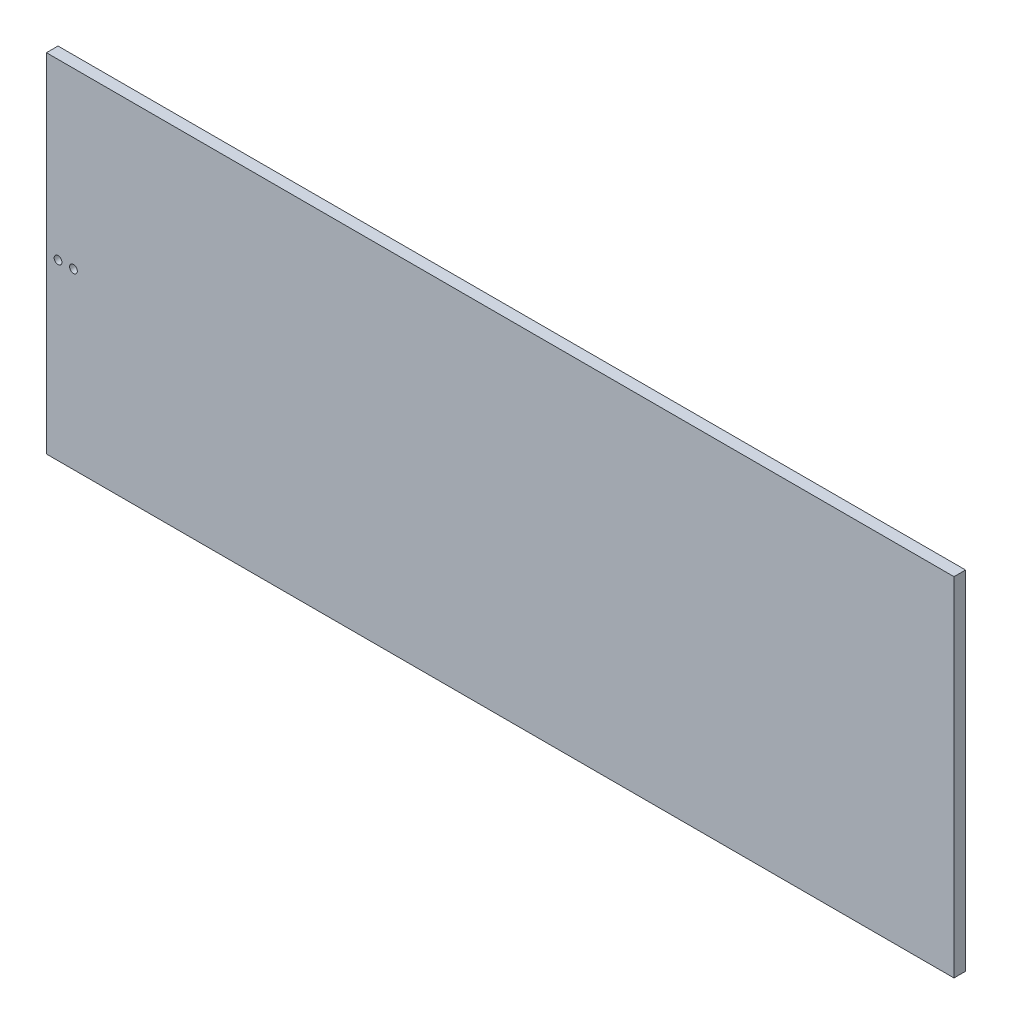
ISO-10303-21;
HEADER;
FILE_DESCRIPTION(('STEP AP214'),'2;1');
FILE_NAME('part.step','',(''),(''),'','','');
FILE_SCHEMA(('AUTOMOTIVE_DESIGN { 1 0 10303 214 1 1 1 1 }'));
ENDSEC;
DATA;
#1=APPLICATION_CONTEXT('core data for automotive mechanical design processes');
#2=APPLICATION_PROTOCOL_DEFINITION('international standard','automotive_design',2000,#1);
#3=PRODUCT_CONTEXT('',#1,'mechanical');
#4=PRODUCT('Part','Part','',(#3));
#5=PRODUCT_RELATED_PRODUCT_CATEGORY('part','',(#4));
#6=PRODUCT_DEFINITION_FORMATION('','',#4);
#7=PRODUCT_DEFINITION_CONTEXT('part definition',#1,'design');
#8=PRODUCT_DEFINITION('design','',#6,#7);
#9=PRODUCT_DEFINITION_SHAPE('','',#8);
#10=(LENGTH_UNIT() NAMED_UNIT(*) SI_UNIT(.MILLI.,.METRE.));
#11=(NAMED_UNIT(*) PLANE_ANGLE_UNIT() SI_UNIT($,.RADIAN.));
#12=(NAMED_UNIT(*) SI_UNIT($,.STERADIAN.) SOLID_ANGLE_UNIT());
#13=UNCERTAINTY_MEASURE_WITH_UNIT(LENGTH_MEASURE(1.E-05),#10,'distance_accuracy_value','');
#14=(GEOMETRIC_REPRESENTATION_CONTEXT(3) GLOBAL_UNCERTAINTY_ASSIGNED_CONTEXT((#13)) GLOBAL_UNIT_ASSIGNED_CONTEXT((#10,
#11,#12)) REPRESENTATION_CONTEXT('',''));
#15=CARTESIAN_POINT('',(0.,0.,0.));
#16=DIRECTION('',(0.,0.,1.));
#17=DIRECTION('',(1.,0.,0.));
#18=AXIS2_PLACEMENT_3D('',#15,#16,#17);
#19=CARTESIAN_POINT('',(117.5,-45.,3.));
#20=DIRECTION('',(-1.,0.,0.));
#21=DIRECTION('',(0.,0.,1.));
#22=AXIS2_PLACEMENT_3D('',#19,#20,#21);
#23=PLANE('',#22);
#24=DIRECTION('',(0.,1.,0.));
#25=VECTOR('',#24,1.);
#26=CARTESIAN_POINT('',(117.5,-45.,0.));
#27=LINE('',#26,#25);
#28=CARTESIAN_POINT('',(117.5,-45.,0.));
#29=VERTEX_POINT('',#28);
#30=CARTESIAN_POINT('',(117.5,45.,0.));
#31=VERTEX_POINT('',#30);
#32=EDGE_CURVE('E155',#29,#31,#27,.T.);
#33=ORIENTED_EDGE('',*,*,#32,.T.);
#34=DIRECTION('',(0.,0.,-1.));
#35=VECTOR('',#34,1.);
#36=CARTESIAN_POINT('',(117.5,45.,3.));
#37=LINE('',#36,#35);
#38=CARTESIAN_POINT('',(117.5,45.,3.));
#39=VERTEX_POINT('',#38);
#40=EDGE_CURVE('E11',#39,#31,#37,.T.);
#41=ORIENTED_EDGE('',*,*,#40,.F.);
#42=DIRECTION('',(0.,1.,0.));
#43=VECTOR('',#42,1.);
#44=CARTESIAN_POINT('',(117.5,-45.,3.));
#45=LINE('',#44,#43);
#46=CARTESIAN_POINT('',(117.5,-45.,3.));
#47=VERTEX_POINT('',#46);
#48=EDGE_CURVE('E144',#47,#39,#45,.T.);
#49=ORIENTED_EDGE('',*,*,#48,.F.);
#50=DIRECTION('',(0.,0.,-1.));
#51=VECTOR('',#50,1.);
#52=CARTESIAN_POINT('',(117.5,-45.,3.));
#53=LINE('',#52,#51);
#54=EDGE_CURVE('E154',#47,#29,#53,.T.);
#55=ORIENTED_EDGE('',*,*,#54,.T.);
#56=EDGE_LOOP('',(#33,#41,#49,#55));
#57=FACE_BOUND('',#56,.T.);
#58=ADVANCED_FACE('F38',(#57),#23,.F.);
#59=CARTESIAN_POINT('',(-117.5,45.,3.));
#60=DIRECTION('',(0.,-1.,0.));
#61=DIRECTION('',(0.,0.,-1.));
#62=AXIS2_PLACEMENT_3D('',#59,#60,#61);
#63=PLANE('',#62);
#64=DIRECTION('',(-1.,0.,0.));
#65=VECTOR('',#64,1.);
#66=CARTESIAN_POINT('',(-117.5,45.,0.));
#67=LINE('',#66,#65);
#68=CARTESIAN_POINT('',(-117.5,45.,0.));
#69=VERTEX_POINT('',#68);
#70=EDGE_CURVE('E159',#31,#69,#67,.T.);
#71=ORIENTED_EDGE('',*,*,#70,.T.);
#72=DIRECTION('',(0.,0.,-1.));
#73=VECTOR('',#72,1.);
#74=CARTESIAN_POINT('',(-117.5,45.,3.));
#75=LINE('',#74,#73);
#76=CARTESIAN_POINT('',(-117.5,45.,3.));
#77=VERTEX_POINT('',#76);
#78=EDGE_CURVE('E46',#77,#69,#75,.T.);
#79=ORIENTED_EDGE('',*,*,#78,.F.);
#80=DIRECTION('',(-1.,0.,0.));
#81=VECTOR('',#80,1.);
#82=CARTESIAN_POINT('',(-117.5,45.,3.));
#83=LINE('',#82,#81);
#84=EDGE_CURVE('E90',#39,#77,#83,.T.);
#85=ORIENTED_EDGE('',*,*,#84,.F.);
#86=ORIENTED_EDGE('',*,*,#40,.T.);
#87=EDGE_LOOP('',(#71,#79,#85,#86));
#88=FACE_BOUND('',#87,.T.);
#89=ADVANCED_FACE('F236',(#88),#63,.F.);
#90=CARTESIAN_POINT('',(-117.5,-45.,3.));
#91=DIRECTION('',(1.,0.,0.));
#92=DIRECTION('',(0.,0.,-1.));
#93=AXIS2_PLACEMENT_3D('',#90,#91,#92);
#94=PLANE('',#93);
#95=DIRECTION('',(0.,-1.,0.));
#96=VECTOR('',#95,1.);
#97=CARTESIAN_POINT('',(-117.5,-45.,0.));
#98=LINE('',#97,#96);
#99=CARTESIAN_POINT('',(-117.5,4.,0.));
#100=VERTEX_POINT('',#99);
#101=EDGE_CURVE('E163',#69,#100,#98,.T.);
#102=ORIENTED_EDGE('',*,*,#101,.T.);
#103=DIRECTION('',(0.,0.,-1.));
#104=VECTOR('',#103,1.);
#105=CARTESIAN_POINT('',(-117.5,4.,0.));
#106=LINE('',#105,#104);
#107=CARTESIAN_POINT('',(-117.5,4.,1.));
#108=VERTEX_POINT('',#107);
#109=EDGE_CURVE('E130',#108,#100,#106,.T.);
#110=ORIENTED_EDGE('',*,*,#109,.F.);
#111=DIRECTION('',(0.,1.,0.));
#112=VECTOR('',#111,1.);
#113=CARTESIAN_POINT('',(-117.5,4.,1.));
#114=LINE('',#113,#112);
#115=CARTESIAN_POINT('',(-117.5,-4.,1.00000000000001));
#116=VERTEX_POINT('',#115);
#117=EDGE_CURVE('E189',#116,#108,#114,.T.);
#118=ORIENTED_EDGE('',*,*,#117,.F.);
#119=DIRECTION('',(0.,0.,1.));
#120=VECTOR('',#119,1.);
#121=CARTESIAN_POINT('',(-117.5,-4.,0.));
#122=LINE('',#121,#120);
#123=CARTESIAN_POINT('',(-117.5,-4.,0.));
#124=VERTEX_POINT('',#123);
#125=EDGE_CURVE('E193',#124,#116,#122,.T.);
#126=ORIENTED_EDGE('',*,*,#125,.F.);
#127=CARTESIAN_POINT('',(-117.5,-45.,0.));
#128=VERTEX_POINT('',#127);
#129=EDGE_CURVE('E134',#124,#128,#98,.T.);
#130=ORIENTED_EDGE('',*,*,#129,.T.);
#131=DIRECTION('',(0.,0.,-1.));
#132=VECTOR('',#131,1.);
#133=CARTESIAN_POINT('',(-117.5,-45.,3.));
#134=LINE('',#133,#132);
#135=CARTESIAN_POINT('',(-117.5,-45.,3.));
#136=VERTEX_POINT('',#135);
#137=EDGE_CURVE('E171',#136,#128,#134,.T.);
#138=ORIENTED_EDGE('',*,*,#137,.F.);
#139=DIRECTION('',(0.,-1.,0.));
#140=VECTOR('',#139,1.);
#141=CARTESIAN_POINT('',(-117.5,-45.,3.));
#142=LINE('',#141,#140);
#143=EDGE_CURVE('E149',#77,#136,#142,.T.);
#144=ORIENTED_EDGE('',*,*,#143,.F.);
#145=ORIENTED_EDGE('',*,*,#78,.T.);
#146=EDGE_LOOP('',(#102,#110,#118,#126,#130,#138,#144,#145));
#147=FACE_BOUND('',#146,.T.);
#148=ADVANCED_FACE('F178',(#147),#94,.F.);
#149=CARTESIAN_POINT('',(-117.5,-45.,3.));
#150=DIRECTION('',(0.,1.,0.));
#151=DIRECTION('',(0.,0.,1.));
#152=AXIS2_PLACEMENT_3D('',#149,#150,#151);
#153=PLANE('',#152);
#154=DIRECTION('',(1.,0.,0.));
#155=VECTOR('',#154,1.);
#156=CARTESIAN_POINT('',(-117.5,-45.,0.));
#157=LINE('',#156,#155);
#158=EDGE_CURVE('E83',#128,#29,#157,.T.);
#159=ORIENTED_EDGE('',*,*,#158,.T.);
#160=ORIENTED_EDGE('',*,*,#54,.F.);
#161=DIRECTION('',(1.,0.,0.));
#162=VECTOR('',#161,1.);
#163=CARTESIAN_POINT('',(-117.5,-45.,3.));
#164=LINE('',#163,#162);
#165=EDGE_CURVE('E62',#136,#47,#164,.T.);
#166=ORIENTED_EDGE('',*,*,#165,.F.);
#167=ORIENTED_EDGE('',*,*,#137,.T.);
#168=EDGE_LOOP('',(#159,#160,#166,#167));
#169=FACE_BOUND('',#168,.T.);
#170=ADVANCED_FACE('F243',(#169),#153,.F.);
#171=CARTESIAN_POINT('',(0.,0.,3.));
#172=DIRECTION('',(0.,0.,-1.));
#173=DIRECTION('',(-1.,0.,0.));
#174=AXIS2_PLACEMENT_3D('',#171,#172,#173);
#175=PLANE('',#174);
#176=CARTESIAN_POINT('',(-110.5,0.,3.));
#177=DIRECTION('',(0.,0.,-1.));
#178=DIRECTION('',(-1.,0.,0.));
#179=AXIS2_PLACEMENT_3D('',#176,#177,#178);
#180=CIRCLE('',#179,0.999999999999998);
#181=CARTESIAN_POINT('',(-111.5,0.,3.));
#182=VERTEX_POINT('',#181);
#183=EDGE_CURVE('E195',#182,#182,#180,.T.);
#184=ORIENTED_EDGE('',*,*,#183,.T.);
#185=EDGE_LOOP('',(#184));
#186=FACE_BOUND('',#185,.T.);
#187=CARTESIAN_POINT('',(-114.5,0.,3.));
#188=DIRECTION('',(0.,0.,-1.));
#189=DIRECTION('',(-1.,0.,0.));
#190=AXIS2_PLACEMENT_3D('',#187,#188,#189);
#191=CIRCLE('',#190,0.999999999999998);
#192=CARTESIAN_POINT('',(-115.5,0.,3.));
#193=VERTEX_POINT('',#192);
#194=EDGE_CURVE('E202',#193,#193,#191,.T.);
#195=ORIENTED_EDGE('',*,*,#194,.T.);
#196=EDGE_LOOP('',(#195));
#197=FACE_BOUND('',#196,.T.);
#198=ORIENTED_EDGE('',*,*,#48,.T.);
#199=ORIENTED_EDGE('',*,*,#84,.T.);
#200=ORIENTED_EDGE('',*,*,#143,.T.);
#201=ORIENTED_EDGE('',*,*,#165,.T.);
#202=EDGE_LOOP('',(#198,#199,#200,#201));
#203=FACE_BOUND('',#202,.T.);
#204=ADVANCED_FACE('F232',(#186,#197,#203),#175,.F.);
#205=CARTESIAN_POINT('',(0.,0.,0.));
#206=DIRECTION('',(0.,0.,-1.));
#207=DIRECTION('',(-1.,0.,0.));
#208=AXIS2_PLACEMENT_3D('',#205,#206,#207);
#209=PLANE('',#208);
#210=DIRECTION('',(-1.,0.,0.));
#211=VECTOR('',#210,1.);
#212=CARTESIAN_POINT('',(-107.5,4.,0.));
#213=LINE('',#212,#211);
#214=CARTESIAN_POINT('',(-107.5,4.,0.));
#215=VERTEX_POINT('',#214);
#216=EDGE_CURVE('E160',#215,#100,#213,.T.);
#217=ORIENTED_EDGE('',*,*,#216,.T.);
#218=ORIENTED_EDGE('',*,*,#101,.F.);
#219=ORIENTED_EDGE('',*,*,#70,.F.);
#220=ORIENTED_EDGE('',*,*,#32,.F.);
#221=ORIENTED_EDGE('',*,*,#158,.F.);
#222=ORIENTED_EDGE('',*,*,#129,.F.);
#223=DIRECTION('',(-1.,0.,0.));
#224=VECTOR('',#223,1.);
#225=CARTESIAN_POINT('',(-107.5,-4.,0.));
#226=LINE('',#225,#224);
#227=CARTESIAN_POINT('',(-107.5,-4.,0.));
#228=VERTEX_POINT('',#227);
#229=EDGE_CURVE('E117',#228,#124,#226,.T.);
#230=ORIENTED_EDGE('',*,*,#229,.F.);
#231=DIRECTION('',(0.,-1.,0.));
#232=VECTOR('',#231,1.);
#233=CARTESIAN_POINT('',(-107.5,4.,0.));
#234=LINE('',#233,#232);
#235=EDGE_CURVE('E123',#215,#228,#234,.T.);
#236=ORIENTED_EDGE('',*,*,#235,.F.);
#237=EDGE_LOOP('',(#217,#218,#219,#220,#221,#222,#230,#236));
#238=FACE_BOUND('',#237,.T.);
#239=ADVANCED_FACE('F133',(#238),#209,.T.);
#240=CARTESIAN_POINT('',(-107.5,4.,0.));
#241=DIRECTION('',(0.,1.,0.));
#242=DIRECTION('',(0.,0.,1.));
#243=AXIS2_PLACEMENT_3D('',#240,#241,#242);
#244=PLANE('',#243);
#245=ORIENTED_EDGE('',*,*,#109,.T.);
#246=ORIENTED_EDGE('',*,*,#216,.F.);
#247=DIRECTION('',(0.,0.,-1.));
#248=VECTOR('',#247,1.);
#249=CARTESIAN_POINT('',(-107.5,4.,0.));
#250=LINE('',#249,#248);
#251=CARTESIAN_POINT('',(-107.5,4.,1.));
#252=VERTEX_POINT('',#251);
#253=EDGE_CURVE('E53',#252,#215,#250,.T.);
#254=ORIENTED_EDGE('',*,*,#253,.F.);
#255=DIRECTION('',(-1.,0.,0.));
#256=VECTOR('',#255,1.);
#257=CARTESIAN_POINT('',(-107.5,4.,1.));
#258=LINE('',#257,#256);
#259=EDGE_CURVE('E139',#252,#108,#258,.T.);
#260=ORIENTED_EDGE('',*,*,#259,.T.);
#261=EDGE_LOOP('',(#245,#246,#254,#260));
#262=FACE_BOUND('',#261,.T.);
#263=ADVANCED_FACE('F221',(#262),#244,.F.);
#264=CARTESIAN_POINT('',(-107.5,4.,1.));
#265=DIRECTION('',(0.,0.,1.));
#266=DIRECTION('',(0.,-1.,0.));
#267=AXIS2_PLACEMENT_3D('',#264,#265,#266);
#268=PLANE('',#267);
#269=CARTESIAN_POINT('',(-110.5,0.,1.));
#270=DIRECTION('',(0.,0.,-1.));
#271=DIRECTION('',(0.,1.,0.));
#272=AXIS2_PLACEMENT_3D('',#269,#270,#271);
#273=CIRCLE('',#272,0.999999999999998);
#274=CARTESIAN_POINT('',(-110.5,0.999999999999998,1.));
#275=VERTEX_POINT('',#274);
#276=EDGE_CURVE('E206',#275,#275,#273,.T.);
#277=ORIENTED_EDGE('',*,*,#276,.F.);
#278=EDGE_LOOP('',(#277));
#279=FACE_BOUND('',#278,.T.);
#280=CARTESIAN_POINT('',(-114.5,0.,1.));
#281=DIRECTION('',(0.,0.,-1.));
#282=DIRECTION('',(0.,1.,0.));
#283=AXIS2_PLACEMENT_3D('',#280,#281,#282);
#284=CIRCLE('',#283,0.999999999999998);
#285=CARTESIAN_POINT('',(-114.5,0.999999999999999,1.));
#286=VERTEX_POINT('',#285);
#287=EDGE_CURVE('E207',#286,#286,#284,.T.);
#288=ORIENTED_EDGE('',*,*,#287,.F.);
#289=EDGE_LOOP('',(#288));
#290=FACE_BOUND('',#289,.T.);
#291=ORIENTED_EDGE('',*,*,#117,.T.);
#292=ORIENTED_EDGE('',*,*,#259,.F.);
#293=DIRECTION('',(0.,1.,0.));
#294=VECTOR('',#293,1.);
#295=CARTESIAN_POINT('',(-107.5,4.,1.));
#296=LINE('',#295,#294);
#297=CARTESIAN_POINT('',(-107.5,-4.,1.00000000000001));
#298=VERTEX_POINT('',#297);
#299=EDGE_CURVE('E122',#298,#252,#296,.T.);
#300=ORIENTED_EDGE('',*,*,#299,.F.);
#301=DIRECTION('',(-1.,0.,0.));
#302=VECTOR('',#301,1.);
#303=CARTESIAN_POINT('',(-107.5,-4.,1.00000000000001));
#304=LINE('',#303,#302);
#305=EDGE_CURVE('E119',#298,#116,#304,.T.);
#306=ORIENTED_EDGE('',*,*,#305,.T.);
#307=EDGE_LOOP('',(#291,#292,#300,#306));
#308=FACE_BOUND('',#307,.T.);
#309=ADVANCED_FACE('F218',(#279,#290,#308),#268,.F.);
#310=CARTESIAN_POINT('',(-107.5,-4.,0.));
#311=DIRECTION('',(0.,-1.,0.));
#312=DIRECTION('',(0.,0.,-1.));
#313=AXIS2_PLACEMENT_3D('',#310,#311,#312);
#314=PLANE('',#313);
#315=ORIENTED_EDGE('',*,*,#125,.T.);
#316=ORIENTED_EDGE('',*,*,#305,.F.);
#317=DIRECTION('',(0.,0.,1.));
#318=VECTOR('',#317,1.);
#319=CARTESIAN_POINT('',(-107.5,-4.,0.));
#320=LINE('',#319,#318);
#321=EDGE_CURVE('E113',#228,#298,#320,.T.);
#322=ORIENTED_EDGE('',*,*,#321,.F.);
#323=ORIENTED_EDGE('',*,*,#229,.T.);
#324=EDGE_LOOP('',(#315,#316,#322,#323));
#325=FACE_BOUND('',#324,.T.);
#326=ADVANCED_FACE('F115',(#325),#314,.F.);
#327=CARTESIAN_POINT('',(-107.5,0.,0.));
#328=DIRECTION('',(-1.,0.,0.));
#329=DIRECTION('',(0.,0.,1.));
#330=AXIS2_PLACEMENT_3D('',#327,#328,#329);
#331=PLANE('',#330);
#332=ORIENTED_EDGE('',*,*,#235,.T.);
#333=ORIENTED_EDGE('',*,*,#321,.T.);
#334=ORIENTED_EDGE('',*,*,#299,.T.);
#335=ORIENTED_EDGE('',*,*,#253,.T.);
#336=EDGE_LOOP('',(#332,#333,#334,#335));
#337=FACE_BOUND('',#336,.T.);
#338=ADVANCED_FACE('F126',(#337),#331,.T.);
#339=CARTESIAN_POINT('',(-114.5,0.,11.));
#340=DIRECTION('',(0.,0.,-1.));
#341=DIRECTION('',(0.,1.,0.));
#342=AXIS2_PLACEMENT_3D('',#339,#340,#341);
#343=CYLINDRICAL_SURFACE('',#342,0.999999999999998);
#344=ORIENTED_EDGE('',*,*,#287,.T.);
#345=EDGE_LOOP('',(#344));
#346=FACE_BOUND('',#345,.T.);
#347=ORIENTED_EDGE('',*,*,#194,.F.);
#348=EDGE_LOOP('',(#347));
#349=FACE_BOUND('',#348,.T.);
#350=ADVANCED_FACE('F260',(#346,#349),#343,.F.);
#351=CARTESIAN_POINT('',(-110.5,0.,11.));
#352=DIRECTION('',(0.,0.,-1.));
#353=DIRECTION('',(0.,1.,0.));
#354=AXIS2_PLACEMENT_3D('',#351,#352,#353);
#355=CYLINDRICAL_SURFACE('',#354,0.999999999999998);
#356=ORIENTED_EDGE('',*,*,#276,.T.);
#357=EDGE_LOOP('',(#356));
#358=FACE_BOUND('',#357,.T.);
#359=ORIENTED_EDGE('',*,*,#183,.F.);
#360=EDGE_LOOP('',(#359));
#361=FACE_BOUND('',#360,.T.);
#362=ADVANCED_FACE('F215',(#358,#361),#355,.F.);
#363=CLOSED_SHELL('',(#58,#89,#148,#170,#204,#239,#263,#309,#326,#338,#350,#362));
#364=MANIFOLD_SOLID_BREP('B2',#363);
#365=ADVANCED_BREP_SHAPE_REPRESENTATION('',(#18,#364),#14);
#366=SHAPE_DEFINITION_REPRESENTATION(#9,#365);
ENDSEC;
END-ISO-10303-21;
